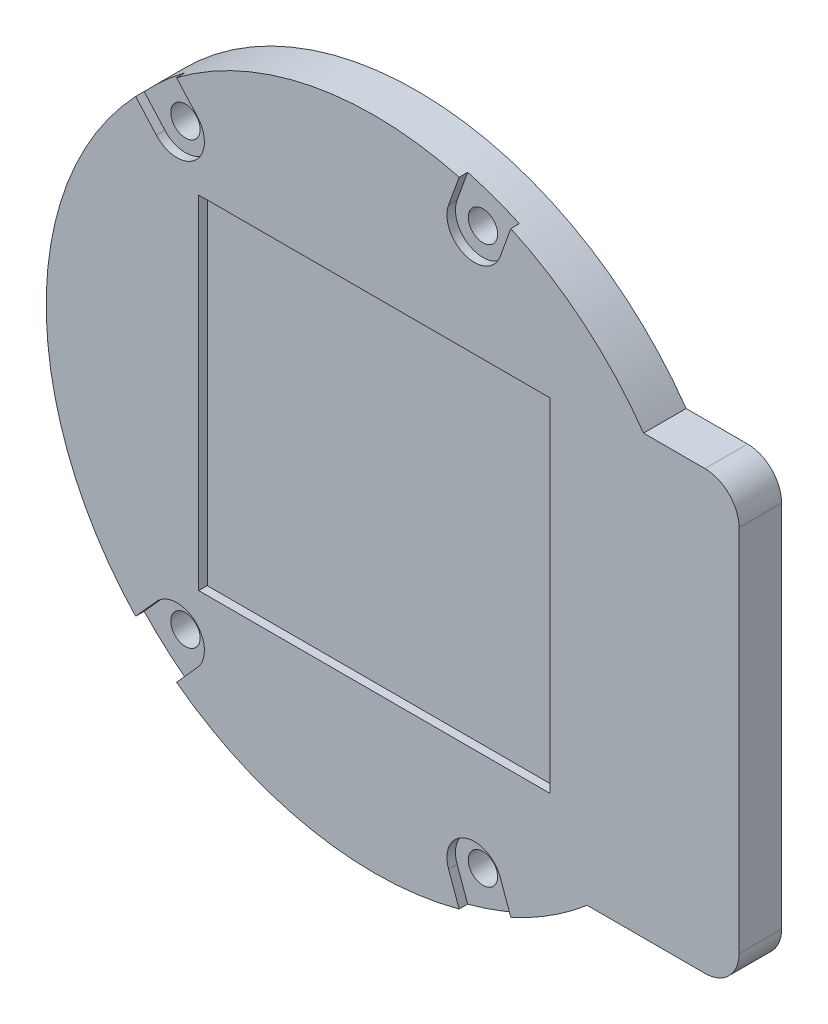
ISO-10303-21;
HEADER;
FILE_DESCRIPTION(('STEP AP214'),'2;1');
FILE_NAME('part.step','',(''),(''),'','','');
FILE_SCHEMA(('AUTOMOTIVE_DESIGN { 1 0 10303 214 1 1 1 1 }'));
ENDSEC;
DATA;
#1=APPLICATION_CONTEXT('core data for automotive mechanical design processes');
#2=APPLICATION_PROTOCOL_DEFINITION('international standard','automotive_design',2000,#1);
#3=PRODUCT_CONTEXT('',#1,'mechanical');
#4=PRODUCT('Part','Part','',(#3));
#5=PRODUCT_RELATED_PRODUCT_CATEGORY('part','',(#4));
#6=PRODUCT_DEFINITION_FORMATION('','',#4);
#7=PRODUCT_DEFINITION_CONTEXT('part definition',#1,'design');
#8=PRODUCT_DEFINITION('design','',#6,#7);
#9=PRODUCT_DEFINITION_SHAPE('','',#8);
#10=(LENGTH_UNIT() NAMED_UNIT(*) SI_UNIT(.MILLI.,.METRE.));
#11=(NAMED_UNIT(*) PLANE_ANGLE_UNIT() SI_UNIT($,.RADIAN.));
#12=(NAMED_UNIT(*) SI_UNIT($,.STERADIAN.) SOLID_ANGLE_UNIT());
#13=UNCERTAINTY_MEASURE_WITH_UNIT(LENGTH_MEASURE(1.E-05),#10,'distance_accuracy_value','');
#14=(GEOMETRIC_REPRESENTATION_CONTEXT(3) GLOBAL_UNCERTAINTY_ASSIGNED_CONTEXT((#13)) GLOBAL_UNIT_ASSIGNED_CONTEXT((#10,
#11,#12)) REPRESENTATION_CONTEXT('',''));
#15=CARTESIAN_POINT('',(0.,0.,0.));
#16=DIRECTION('',(0.,0.,1.));
#17=DIRECTION('',(1.,0.,0.));
#18=AXIS2_PLACEMENT_3D('',#15,#16,#17);
#19=CARTESIAN_POINT('',(0.,0.,4.));
#20=DIRECTION('',(0.,0.,1.));
#21=DIRECTION('',(1.,0.,0.));
#22=AXIS2_PLACEMENT_3D('',#19,#20,#21);
#23=PLANE('',#22);
#24=DIRECTION('',(0.338622846225682,-0.940922190201729,0.));
#25=VECTOR('',#24,1.);
#26=CARTESIAN_POINT('',(14.7846868274317,-31.5579413209222,4.));
#27=LINE('',#26,#25);
#28=CARTESIAN_POINT('',(14.7846868274317,-31.5579413209222,4.));
#29=VERTEX_POINT('',#28);
#30=CARTESIAN_POINT('',(16.0256343042209,-35.0061286798094,4.));
#31=VERTEX_POINT('',#30);
#32=EDGE_CURVE('E254',#29,#31,#27,.T.);
#33=ORIENTED_EDGE('',*,*,#32,.F.);
#34=CARTESIAN_POINT('',(11.7502127640311,-32.65,4.));
#35=DIRECTION('',(0.,0.,-1.));
#36=DIRECTION('',(-1.,0.,0.));
#37=AXIS2_PLACEMENT_3D('',#34,#35,#36);
#38=CIRCLE('',#37,3.225);
#39=CARTESIAN_POINT('',(8.71573870063056,-33.7420586790778,4.));
#40=VERTEX_POINT('',#39);
#41=EDGE_CURVE('E391',#40,#29,#38,.T.);
#42=ORIENTED_EDGE('',*,*,#41,.F.);
#43=DIRECTION('',(-0.338622846225681,0.940922190201729,0.));
#44=VECTOR('',#43,1.);
#45=CARTESIAN_POINT('',(8.71573870063056,-33.7420586790778,4.));
#46=LINE('',#45,#44);
#47=CARTESIAN_POINT('',(9.95668617741978,-37.1902460379651,4.));
#48=VERTEX_POINT('',#47);
#49=EDGE_CURVE('E800',#48,#40,#46,.T.);
#50=ORIENTED_EDGE('',*,*,#49,.F.);
#51=CARTESIAN_POINT('',(0.,0.,4.));
#52=DIRECTION('',(0.,0.,1.));
#53=DIRECTION('',(1.,0.,0.));
#54=AXIS2_PLACEMENT_3D('',#51,#52,#53);
#55=CIRCLE('',#54,38.5);
#56=EDGE_CURVE('E353',#48,#31,#55,.T.);
#57=ORIENTED_EDGE('',*,*,#56,.T.);
#58=EDGE_LOOP('',(#33,#42,#50,#57));
#59=FACE_BOUND('',#58,.T.);
#60=CARTESIAN_POINT('',(11.7502127640311,-32.65,4.));
#61=DIRECTION('',(0.,0.,1.));
#62=DIRECTION('',(1.,0.,0.));
#63=AXIS2_PLACEMENT_3D('',#60,#61,#62);
#64=CIRCLE('',#63,1.725);
#65=CARTESIAN_POINT('',(13.4752127640311,-32.65,4.));
#66=VERTEX_POINT('',#65);
#67=EDGE_CURVE('E435',#66,#66,#64,.T.);
#68=ORIENTED_EDGE('',*,*,#67,.F.);
#69=EDGE_LOOP('',(#68));
#70=FACE_BOUND('',#69,.T.);
#71=ADVANCED_FACE('F32',(#59,#70),#23,.T.);
#72=DIRECTION('',(-0.667434411909216,-0.744668587896253,0.));
#73=VECTOR('',#72,1.);
#74=CARTESIAN_POINT('',(-20.7584178972843,-27.9924759784072,4.));
#75=LINE('',#74,#73);
#76=CARTESIAN_POINT('',(-20.7584178972843,-27.9924759784072,4.));
#77=VERTEX_POINT('',#76);
#78=CARTESIAN_POINT('',(-23.2043575573303,-30.7214548866353,4.));
#79=VERTEX_POINT('',#78);
#80=EDGE_CURVE('E801',#77,#79,#75,.T.);
#81=ORIENTED_EDGE('',*,*,#80,.F.);
#82=CARTESIAN_POINT('',(-23.1599740932498,-25.84,4.));
#83=DIRECTION('',(0.,0.,-1.));
#84=DIRECTION('',(-1.,0.,0.));
#85=AXIS2_PLACEMENT_3D('',#82,#83,#84);
#86=CIRCLE('',#85,3.225);
#87=CARTESIAN_POINT('',(-25.5615302892152,-23.6875240215928,4.));
#88=VERTEX_POINT('',#87);
#89=EDGE_CURVE('E804',#88,#77,#86,.T.);
#90=ORIENTED_EDGE('',*,*,#89,.F.);
#91=DIRECTION('',(0.667434411909216,0.744668587896253,0.));
#92=VECTOR('',#91,1.);
#93=CARTESIAN_POINT('',(-25.5615302892152,-23.6875240215928,4.));
#94=LINE('',#93,#92);
#95=CARTESIAN_POINT('',(-28.0074699492611,-26.4165029298209,4.));
#96=VERTEX_POINT('',#95);
#97=EDGE_CURVE('E817',#96,#88,#94,.T.);
#98=ORIENTED_EDGE('',*,*,#97,.F.);
#99=EDGE_CURVE('E375',#96,#79,#55,.T.);
#100=ORIENTED_EDGE('',*,*,#99,.T.);
#101=EDGE_LOOP('',(#81,#90,#98,#100));
#102=FACE_BOUND('',#101,.T.);
#103=CARTESIAN_POINT('',(-23.1599740932498,-25.84,4.));
#104=DIRECTION('',(0.,0.,1.));
#105=DIRECTION('',(1.,0.,0.));
#106=AXIS2_PLACEMENT_3D('',#103,#104,#105);
#107=CIRCLE('',#106,1.725);
#108=CARTESIAN_POINT('',(-21.4349740932498,-25.84,4.));
#109=VERTEX_POINT('',#108);
#110=EDGE_CURVE('E439',#109,#109,#107,.T.);
#111=ORIENTED_EDGE('',*,*,#110,.F.);
#112=EDGE_LOOP('',(#111));
#113=FACE_BOUND('',#112,.T.);
#114=ADVANCED_FACE('F462',(#102,#113),#23,.T.);
#115=DIRECTION('',(-0.667434411909216,0.744668587896253,0.));
#116=VECTOR('',#115,1.);
#117=CARTESIAN_POINT('',(-25.5615302892152,23.6875240215928,4.));
#118=LINE('',#117,#116);
#119=CARTESIAN_POINT('',(-25.5615302892152,23.6875240215928,4.));
#120=VERTEX_POINT('',#119);
#121=CARTESIAN_POINT('',(-28.0074699492611,26.4165029298209,4.));
#122=VERTEX_POINT('',#121);
#123=EDGE_CURVE('E820',#120,#122,#118,.T.);
#124=ORIENTED_EDGE('',*,*,#123,.F.);
#125=CARTESIAN_POINT('',(-23.1599740932498,25.84,4.));
#126=DIRECTION('',(0.,0.,-1.));
#127=DIRECTION('',(1.,0.,0.));
#128=AXIS2_PLACEMENT_3D('',#125,#126,#127);
#129=CIRCLE('',#128,3.225);
#130=CARTESIAN_POINT('',(-20.7584178972843,27.9924759784072,4.));
#131=VERTEX_POINT('',#130);
#132=EDGE_CURVE('E300',#131,#120,#129,.T.);
#133=ORIENTED_EDGE('',*,*,#132,.F.);
#134=DIRECTION('',(0.667434411909216,-0.744668587896253,0.));
#135=VECTOR('',#134,1.);
#136=CARTESIAN_POINT('',(-20.7584178972843,27.9924759784072,4.));
#137=LINE('',#136,#135);
#138=CARTESIAN_POINT('',(-23.2043575573303,30.7214548866353,4.));
#139=VERTEX_POINT('',#138);
#140=EDGE_CURVE('E306',#139,#131,#137,.T.);
#141=ORIENTED_EDGE('',*,*,#140,.F.);
#142=EDGE_CURVE('E365',#139,#122,#55,.T.);
#143=ORIENTED_EDGE('',*,*,#142,.T.);
#144=EDGE_LOOP('',(#124,#133,#141,#143));
#145=FACE_BOUND('',#144,.T.);
#146=CARTESIAN_POINT('',(-23.1599740932498,25.84,4.));
#147=DIRECTION('',(0.,0.,1.));
#148=DIRECTION('',(1.,0.,0.));
#149=AXIS2_PLACEMENT_3D('',#146,#147,#148);
#150=CIRCLE('',#149,1.725);
#151=CARTESIAN_POINT('',(-21.4349740932498,25.84,4.));
#152=VERTEX_POINT('',#151);
#153=EDGE_CURVE('E429',#152,#152,#150,.T.);
#154=ORIENTED_EDGE('',*,*,#153,.F.);
#155=EDGE_LOOP('',(#154));
#156=FACE_BOUND('',#155,.T.);
#157=ADVANCED_FACE('F468',(#145,#156),#23,.T.);
#158=DIRECTION('',(0.338622846225681,0.940922190201729,0.));
#159=VECTOR('',#158,1.);
#160=CARTESIAN_POINT('',(8.71573870063056,33.7420586790778,4.));
#161=LINE('',#160,#159);
#162=CARTESIAN_POINT('',(8.71573870063056,33.7420586790778,4.));
#163=VERTEX_POINT('',#162);
#164=CARTESIAN_POINT('',(9.95668617741978,37.1902460379651,4.));
#165=VERTEX_POINT('',#164);
#166=EDGE_CURVE('E297',#163,#165,#161,.T.);
#167=ORIENTED_EDGE('',*,*,#166,.F.);
#168=CARTESIAN_POINT('',(11.7502127640311,32.65,4.));
#169=DIRECTION('',(0.,0.,-1.));
#170=DIRECTION('',(1.,0.,0.));
#171=AXIS2_PLACEMENT_3D('',#168,#169,#170);
#172=CIRCLE('',#171,3.225);
#173=CARTESIAN_POINT('',(14.7846868274317,31.5579413209222,4.));
#174=VERTEX_POINT('',#173);
#175=EDGE_CURVE('E294',#174,#163,#172,.T.);
#176=ORIENTED_EDGE('',*,*,#175,.F.);
#177=DIRECTION('',(-0.338622846225682,-0.940922190201729,0.));
#178=VECTOR('',#177,1.);
#179=CARTESIAN_POINT('',(14.7846868274317,31.5579413209222,4.));
#180=LINE('',#179,#178);
#181=CARTESIAN_POINT('',(16.0256343042209,35.0061286798094,4.));
#182=VERTEX_POINT('',#181);
#183=EDGE_CURVE('E226',#182,#174,#180,.T.);
#184=ORIENTED_EDGE('',*,*,#183,.F.);
#185=EDGE_CURVE('E360',#182,#165,#55,.T.);
#186=ORIENTED_EDGE('',*,*,#185,.T.);
#187=EDGE_LOOP('',(#167,#176,#184,#186));
#188=FACE_BOUND('',#187,.T.);
#189=CARTESIAN_POINT('',(11.7502127640311,32.65,4.));
#190=DIRECTION('',(0.,0.,1.));
#191=DIRECTION('',(1.,0.,0.));
#192=AXIS2_PLACEMENT_3D('',#189,#190,#191);
#193=CIRCLE('',#192,1.725);
#194=CARTESIAN_POINT('',(13.4752127640311,32.65,4.));
#195=VERTEX_POINT('',#194);
#196=EDGE_CURVE('E423',#195,#195,#193,.T.);
#197=ORIENTED_EDGE('',*,*,#196,.F.);
#198=EDGE_LOOP('',(#197));
#199=FACE_BOUND('',#198,.T.);
#200=ADVANCED_FACE('F464',(#188,#199),#23,.T.);
#201=CARTESIAN_POINT('',(0.,0.,0.));
#202=DIRECTION('',(0.,0.,1.));
#203=DIRECTION('',(1.,0.,0.));
#204=AXIS2_PLACEMENT_3D('',#201,#202,#203);
#205=PLANE('',#204);
#206=CARTESIAN_POINT('',(-23.1599740932498,25.84,0.));
#207=DIRECTION('',(0.,0.,1.));
#208=DIRECTION('',(1.,0.,0.));
#209=AXIS2_PLACEMENT_3D('',#206,#207,#208);
#210=CIRCLE('',#209,1.725);
#211=CARTESIAN_POINT('',(-21.4349740932498,25.84,0.));
#212=VERTEX_POINT('',#211);
#213=EDGE_CURVE('E426',#212,#212,#210,.T.);
#214=ORIENTED_EDGE('',*,*,#213,.T.);
#215=EDGE_LOOP('',(#214));
#216=FACE_BOUND('',#215,.T.);
#217=CARTESIAN_POINT('',(-23.1599740932498,-25.84,0.));
#218=DIRECTION('',(0.,0.,1.));
#219=DIRECTION('',(1.,0.,0.));
#220=AXIS2_PLACEMENT_3D('',#217,#218,#219);
#221=CIRCLE('',#220,1.725);
#222=CARTESIAN_POINT('',(-21.4349740932498,-25.84,0.));
#223=VERTEX_POINT('',#222);
#224=EDGE_CURVE('E369',#223,#223,#221,.T.);
#225=ORIENTED_EDGE('',*,*,#224,.T.);
#226=EDGE_LOOP('',(#225));
#227=FACE_BOUND('',#226,.T.);
#228=DIRECTION('',(-1.,0.,0.));
#229=VECTOR('',#228,1.);
#230=CARTESIAN_POINT('',(31.5950945559592,22.,0.));
#231=LINE('',#230,#229);
#232=CARTESIAN_POINT('',(38.8,22.,0.));
#233=VERTEX_POINT('',#232);
#234=CARTESIAN_POINT('',(31.5950945559592,22.,0.));
#235=VERTEX_POINT('',#234);
#236=EDGE_CURVE('E348',#233,#235,#231,.T.);
#237=ORIENTED_EDGE('',*,*,#236,.F.);
#238=CARTESIAN_POINT('',(38.8,18.,0.));
#239=DIRECTION('',(0.,0.,1.));
#240=DIRECTION('',(1.,0.,0.));
#241=AXIS2_PLACEMENT_3D('',#238,#239,#240);
#242=CIRCLE('',#241,4.);
#243=CARTESIAN_POINT('',(42.8,18.,0.));
#244=VERTEX_POINT('',#243);
#245=EDGE_CURVE('E322',#233,#244,#242,.F.);
#246=ORIENTED_EDGE('',*,*,#245,.T.);
#247=DIRECTION('',(0.,1.,0.));
#248=VECTOR('',#247,1.);
#249=CARTESIAN_POINT('',(42.8,22.,0.));
#250=LINE('',#249,#248);
#251=CARTESIAN_POINT('',(42.8,-25.3,0.));
#252=VERTEX_POINT('',#251);
#253=EDGE_CURVE('E346',#252,#244,#250,.T.);
#254=ORIENTED_EDGE('',*,*,#253,.F.);
#255=CARTESIAN_POINT('',(38.8,-25.3,0.));
#256=DIRECTION('',(0.,0.,1.));
#257=DIRECTION('',(1.,0.,0.));
#258=AXIS2_PLACEMENT_3D('',#255,#256,#257);
#259=CIRCLE('',#258,4.);
#260=CARTESIAN_POINT('',(38.8,-29.3,0.));
#261=VERTEX_POINT('',#260);
#262=EDGE_CURVE('E319',#252,#261,#259,.F.);
#263=ORIENTED_EDGE('',*,*,#262,.T.);
#264=DIRECTION('',(1.,0.,0.));
#265=VECTOR('',#264,1.);
#266=CARTESIAN_POINT('',(42.8,-29.3,0.));
#267=LINE('',#266,#265);
#268=CARTESIAN_POINT('',(24.9751876869824,-29.3,0.));
#269=VERTEX_POINT('',#268);
#270=EDGE_CURVE('E351',#269,#261,#267,.T.);
#271=ORIENTED_EDGE('',*,*,#270,.F.);
#272=CARTESIAN_POINT('',(0.,0.,0.));
#273=DIRECTION('',(0.,0.,1.));
#274=DIRECTION('',(1.,0.,0.));
#275=AXIS2_PLACEMENT_3D('',#272,#273,#274);
#276=CIRCLE('',#275,38.5);
#277=EDGE_CURVE('E355',#235,#269,#276,.T.);
#278=ORIENTED_EDGE('',*,*,#277,.F.);
#279=EDGE_LOOP('',(#237,#246,#254,#263,#271,#278));
#280=FACE_BOUND('',#279,.T.);
#281=CARTESIAN_POINT('',(11.7502127640311,-32.65,0.));
#282=DIRECTION('',(0.,0.,1.));
#283=DIRECTION('',(1.,0.,0.));
#284=AXIS2_PLACEMENT_3D('',#281,#282,#283);
#285=CIRCLE('',#284,1.725);
#286=CARTESIAN_POINT('',(13.4752127640311,-32.65,0.));
#287=VERTEX_POINT('',#286);
#288=EDGE_CURVE('E432',#287,#287,#285,.T.);
#289=ORIENTED_EDGE('',*,*,#288,.T.);
#290=EDGE_LOOP('',(#289));
#291=FACE_BOUND('',#290,.T.);
#292=CARTESIAN_POINT('',(11.7502127640311,32.65,0.));
#293=DIRECTION('',(0.,0.,1.));
#294=DIRECTION('',(1.,0.,0.));
#295=AXIS2_PLACEMENT_3D('',#292,#293,#294);
#296=CIRCLE('',#295,1.725);
#297=CARTESIAN_POINT('',(13.4752127640311,32.65,0.));
#298=VERTEX_POINT('',#297);
#299=EDGE_CURVE('E384',#298,#298,#296,.T.);
#300=ORIENTED_EDGE('',*,*,#299,.T.);
#301=EDGE_LOOP('',(#300));
#302=FACE_BOUND('',#301,.T.);
#303=ADVANCED_FACE('F344',(#216,#227,#280,#291,#302),#205,.F.);
#304=CARTESIAN_POINT('',(0.,0.,4.));
#305=DIRECTION('',(0.,0.,-1.));
#306=DIRECTION('',(-1.,0.,0.));
#307=AXIS2_PLACEMENT_3D('',#304,#305,#306);
#308=CYLINDRICAL_SURFACE('',#307,38.5);
#309=ORIENTED_EDGE('',*,*,#277,.T.);
#310=DIRECTION('',(0.,0.,-1.));
#311=VECTOR('',#310,1.);
#312=CARTESIAN_POINT('',(24.9751876869824,-29.3,4.));
#313=LINE('',#312,#311);
#314=CARTESIAN_POINT('',(24.9751876869824,-29.3,5.));
#315=VERTEX_POINT('',#314);
#316=EDGE_CURVE('E320',#315,#269,#313,.T.);
#317=ORIENTED_EDGE('',*,*,#316,.F.);
#318=CARTESIAN_POINT('',(0.,0.,5.));
#319=DIRECTION('',(0.,0.,1.));
#320=DIRECTION('',(1.,0.,0.));
#321=AXIS2_PLACEMENT_3D('',#318,#319,#320);
#322=CIRCLE('',#321,38.5);
#323=CARTESIAN_POINT('',(16.0256343042209,-35.0061286798094,5.));
#324=VERTEX_POINT('',#323);
#325=EDGE_CURVE('E284',#324,#315,#322,.T.);
#326=ORIENTED_EDGE('',*,*,#325,.F.);
#327=DIRECTION('',(0.,0.,-1.));
#328=VECTOR('',#327,1.);
#329=CARTESIAN_POINT('',(16.0256343042209,-35.0061286798094,5.));
#330=LINE('',#329,#328);
#331=EDGE_CURVE('E293',#324,#31,#330,.T.);
#332=ORIENTED_EDGE('',*,*,#331,.T.);
#333=ORIENTED_EDGE('',*,*,#56,.F.);
#334=DIRECTION('',(0.,0.,-1.));
#335=VECTOR('',#334,1.);
#336=CARTESIAN_POINT('',(9.95668617741978,-37.1902460379651,5.));
#337=LINE('',#336,#335);
#338=CARTESIAN_POINT('',(9.95668617741978,-37.1902460379651,5.));
#339=VERTEX_POINT('',#338);
#340=EDGE_CURVE('E403',#339,#48,#337,.T.);
#341=ORIENTED_EDGE('',*,*,#340,.F.);
#342=CARTESIAN_POINT('',(0.,0.,5.));
#343=DIRECTION('',(0.,0.,1.));
#344=DIRECTION('',(1.,0.,0.));
#345=AXIS2_PLACEMENT_3D('',#342,#343,#344);
#346=CIRCLE('',#345,38.5);
#347=CARTESIAN_POINT('',(-23.2043575573303,-30.7214548866353,5.));
#348=VERTEX_POINT('',#347);
#349=EDGE_CURVE('E276',#348,#339,#346,.T.);
#350=ORIENTED_EDGE('',*,*,#349,.F.);
#351=DIRECTION('',(0.,0.,-1.));
#352=VECTOR('',#351,1.);
#353=CARTESIAN_POINT('',(-23.2043575573303,-30.7214548866353,5.));
#354=LINE('',#353,#352);
#355=EDGE_CURVE('E408',#348,#79,#354,.T.);
#356=ORIENTED_EDGE('',*,*,#355,.T.);
#357=ORIENTED_EDGE('',*,*,#99,.F.);
#358=DIRECTION('',(0.,0.,-1.));
#359=VECTOR('',#358,1.);
#360=CARTESIAN_POINT('',(-28.0074699492611,-26.4165029298209,5.));
#361=LINE('',#360,#359);
#362=CARTESIAN_POINT('',(-28.0074699492611,-26.4165029298209,5.));
#363=VERTEX_POINT('',#362);
#364=EDGE_CURVE('E411',#363,#96,#361,.T.);
#365=ORIENTED_EDGE('',*,*,#364,.F.);
#366=CARTESIAN_POINT('',(0.,0.,5.));
#367=DIRECTION('',(0.,0.,1.));
#368=DIRECTION('',(1.,0.,0.));
#369=AXIS2_PLACEMENT_3D('',#366,#367,#368);
#370=CIRCLE('',#369,38.5);
#371=CARTESIAN_POINT('',(-28.0074699492611,26.4165029298209,5.));
#372=VERTEX_POINT('',#371);
#373=EDGE_CURVE('E268',#372,#363,#370,.T.);
#374=ORIENTED_EDGE('',*,*,#373,.F.);
#375=DIRECTION('',(0.,0.,-1.));
#376=VECTOR('',#375,1.);
#377=CARTESIAN_POINT('',(-28.0074699492611,26.4165029298209,5.));
#378=LINE('',#377,#376);
#379=EDGE_CURVE('E416',#372,#122,#378,.T.);
#380=ORIENTED_EDGE('',*,*,#379,.T.);
#381=ORIENTED_EDGE('',*,*,#142,.F.);
#382=DIRECTION('',(0.,0.,-1.));
#383=VECTOR('',#382,1.);
#384=CARTESIAN_POINT('',(-23.2043575573303,30.7214548866353,5.));
#385=LINE('',#384,#383);
#386=CARTESIAN_POINT('',(-23.2043575573303,30.7214548866353,5.));
#387=VERTEX_POINT('',#386);
#388=EDGE_CURVE('E313',#387,#139,#385,.T.);
#389=ORIENTED_EDGE('',*,*,#388,.F.);
#390=CARTESIAN_POINT('',(0.,0.,5.));
#391=DIRECTION('',(0.,0.,1.));
#392=DIRECTION('',(1.,0.,0.));
#393=AXIS2_PLACEMENT_3D('',#390,#391,#392);
#394=CIRCLE('',#393,38.5);
#395=CARTESIAN_POINT('',(9.95668617741978,37.1902460379651,5.));
#396=VERTEX_POINT('',#395);
#397=EDGE_CURVE('E260',#396,#387,#394,.T.);
#398=ORIENTED_EDGE('',*,*,#397,.F.);
#399=DIRECTION('',(0.,0.,-1.));
#400=VECTOR('',#399,1.);
#401=CARTESIAN_POINT('',(9.95668617741978,37.1902460379651,5.));
#402=LINE('',#401,#400);
#403=EDGE_CURVE('E309',#396,#165,#402,.T.);
#404=ORIENTED_EDGE('',*,*,#403,.T.);
#405=ORIENTED_EDGE('',*,*,#185,.F.);
#406=DIRECTION('',(0.,0.,-1.));
#407=VECTOR('',#406,1.);
#408=CARTESIAN_POINT('',(16.0256343042209,35.0061286798094,5.));
#409=LINE('',#408,#407);
#410=CARTESIAN_POINT('',(16.0256343042209,35.0061286798094,5.));
#411=VERTEX_POINT('',#410);
#412=EDGE_CURVE('E381',#411,#182,#409,.T.);
#413=ORIENTED_EDGE('',*,*,#412,.F.);
#414=CARTESIAN_POINT('',(0.,0.,5.));
#415=DIRECTION('',(0.,0.,1.));
#416=DIRECTION('',(1.,0.,0.));
#417=AXIS2_PLACEMENT_3D('',#414,#415,#416);
#418=CIRCLE('',#417,38.5);
#419=CARTESIAN_POINT('',(31.5950945559592,22.,5.));
#420=VERTEX_POINT('',#419);
#421=EDGE_CURVE('E250',#420,#411,#418,.T.);
#422=ORIENTED_EDGE('',*,*,#421,.F.);
#423=DIRECTION('',(0.,0.,-1.));
#424=VECTOR('',#423,1.);
#425=CARTESIAN_POINT('',(31.5950945559592,22.,4.));
#426=LINE('',#425,#424);
#427=EDGE_CURVE('E339',#420,#235,#426,.T.);
#428=ORIENTED_EDGE('',*,*,#427,.T.);
#429=EDGE_LOOP('',(#309,#317,#326,#332,#333,#341,#350,#356,#357,#365,#374,#380,#381,#389,#398,
#404,#405,#413,#422,#428));
#430=FACE_BOUND('',#429,.T.);
#431=ADVANCED_FACE('F479',(#430),#308,.T.);
#432=CARTESIAN_POINT('',(42.8,-29.3,4.));
#433=DIRECTION('',(0.,1.,0.));
#434=DIRECTION('',(-1.,0.,0.));
#435=AXIS2_PLACEMENT_3D('',#432,#433,#434);
#436=PLANE('',#435);
#437=ORIENTED_EDGE('',*,*,#270,.T.);
#438=DIRECTION('',(0.,0.,-1.));
#439=VECTOR('',#438,1.);
#440=CARTESIAN_POINT('',(38.8,-29.3,4.));
#441=LINE('',#440,#439);
#442=CARTESIAN_POINT('',(38.8,-29.3,5.));
#443=VERTEX_POINT('',#442);
#444=EDGE_CURVE('E11',#261,#443,#441,.F.);
#445=ORIENTED_EDGE('',*,*,#444,.T.);
#446=DIRECTION('',(1.,0.,0.));
#447=VECTOR('',#446,1.);
#448=CARTESIAN_POINT('',(42.8,-29.3,5.));
#449=LINE('',#448,#447);
#450=EDGE_CURVE('E287',#315,#443,#449,.T.);
#451=ORIENTED_EDGE('',*,*,#450,.F.);
#452=ORIENTED_EDGE('',*,*,#316,.T.);
#453=EDGE_LOOP('',(#437,#445,#451,#452));
#454=FACE_BOUND('',#453,.T.);
#455=ADVANCED_FACE('F666',(#454),#436,.F.);
#456=CARTESIAN_POINT('',(42.8,22.,4.));
#457=DIRECTION('',(-1.,0.,0.));
#458=DIRECTION('',(0.,-1.,0.));
#459=AXIS2_PLACEMENT_3D('',#456,#457,#458);
#460=PLANE('',#459);
#461=ORIENTED_EDGE('',*,*,#253,.T.);
#462=DIRECTION('',(0.,0.,-1.));
#463=VECTOR('',#462,1.);
#464=CARTESIAN_POINT('',(42.8,18.,4.));
#465=LINE('',#464,#463);
#466=CARTESIAN_POINT('',(42.8,18.,5.));
#467=VERTEX_POINT('',#466);
#468=EDGE_CURVE('E53',#244,#467,#465,.F.);
#469=ORIENTED_EDGE('',*,*,#468,.T.);
#470=DIRECTION('',(0.,1.,0.));
#471=VECTOR('',#470,1.);
#472=CARTESIAN_POINT('',(42.8,22.,5.));
#473=LINE('',#472,#471);
#474=CARTESIAN_POINT('',(42.8,-25.3,5.));
#475=VERTEX_POINT('',#474);
#476=EDGE_CURVE('E289',#475,#467,#473,.T.);
#477=ORIENTED_EDGE('',*,*,#476,.F.);
#478=DIRECTION('',(0.,0.,-1.));
#479=VECTOR('',#478,1.);
#480=CARTESIAN_POINT('',(42.8,-25.3,4.));
#481=LINE('',#480,#479);
#482=EDGE_CURVE('E324',#475,#252,#481,.T.);
#483=ORIENTED_EDGE('',*,*,#482,.T.);
#484=EDGE_LOOP('',(#461,#469,#477,#483));
#485=FACE_BOUND('',#484,.T.);
#486=ADVANCED_FACE('F349',(#485),#460,.F.);
#487=CARTESIAN_POINT('',(31.5950945559592,22.,4.));
#488=DIRECTION('',(0.,-1.,0.));
#489=DIRECTION('',(0.,0.,-1.));
#490=AXIS2_PLACEMENT_3D('',#487,#488,#489);
#491=PLANE('',#490);
#492=DIRECTION('',(-1.,0.,0.));
#493=VECTOR('',#492,1.);
#494=CARTESIAN_POINT('',(31.5950945559592,22.,5.));
#495=LINE('',#494,#493);
#496=CARTESIAN_POINT('',(38.8,22.,5.));
#497=VERTEX_POINT('',#496);
#498=EDGE_CURVE('E291',#497,#420,#495,.T.);
#499=ORIENTED_EDGE('',*,*,#498,.F.);
#500=DIRECTION('',(0.,0.,-1.));
#501=VECTOR('',#500,1.);
#502=CARTESIAN_POINT('',(38.8,22.,4.));
#503=LINE('',#502,#501);
#504=EDGE_CURVE('E316',#497,#233,#503,.T.);
#505=ORIENTED_EDGE('',*,*,#504,.T.);
#506=ORIENTED_EDGE('',*,*,#236,.T.);
#507=ORIENTED_EDGE('',*,*,#427,.F.);
#508=EDGE_LOOP('',(#499,#505,#506,#507));
#509=FACE_BOUND('',#508,.T.);
#510=ADVANCED_FACE('F336',(#509),#491,.F.);
#511=CARTESIAN_POINT('',(-23.1599740932498,-25.84,4.));
#512=DIRECTION('',(0.,0.,-1.));
#513=DIRECTION('',(-1.,0.,0.));
#514=AXIS2_PLACEMENT_3D('',#511,#512,#513);
#515=CYLINDRICAL_SURFACE('',#514,1.725);
#516=ORIENTED_EDGE('',*,*,#110,.T.);
#517=EDGE_LOOP('',(#516));
#518=FACE_BOUND('',#517,.T.);
#519=ORIENTED_EDGE('',*,*,#224,.F.);
#520=EDGE_LOOP('',(#519));
#521=FACE_BOUND('',#520,.T.);
#522=ADVANCED_FACE('F448',(#518,#521),#515,.F.);
#523=CARTESIAN_POINT('',(11.7502127640311,-32.65,4.));
#524=DIRECTION('',(0.,0.,-1.));
#525=DIRECTION('',(-1.,0.,0.));
#526=AXIS2_PLACEMENT_3D('',#523,#524,#525);
#527=CYLINDRICAL_SURFACE('',#526,1.725);
#528=ORIENTED_EDGE('',*,*,#67,.T.);
#529=EDGE_LOOP('',(#528));
#530=FACE_BOUND('',#529,.T.);
#531=ORIENTED_EDGE('',*,*,#288,.F.);
#532=EDGE_LOOP('',(#531));
#533=FACE_BOUND('',#532,.T.);
#534=ADVANCED_FACE('F450',(#530,#533),#527,.F.);
#535=CARTESIAN_POINT('',(-23.1599740932498,25.84,4.));
#536=DIRECTION('',(0.,0.,-1.));
#537=DIRECTION('',(-1.,0.,0.));
#538=AXIS2_PLACEMENT_3D('',#535,#536,#537);
#539=CYLINDRICAL_SURFACE('',#538,1.725);
#540=ORIENTED_EDGE('',*,*,#153,.T.);
#541=EDGE_LOOP('',(#540));
#542=FACE_BOUND('',#541,.T.);
#543=ORIENTED_EDGE('',*,*,#213,.F.);
#544=EDGE_LOOP('',(#543));
#545=FACE_BOUND('',#544,.T.);
#546=ADVANCED_FACE('F456',(#542,#545),#539,.F.);
#547=CARTESIAN_POINT('',(11.7502127640311,32.65,4.));
#548=DIRECTION('',(0.,0.,-1.));
#549=DIRECTION('',(-1.,0.,0.));
#550=AXIS2_PLACEMENT_3D('',#547,#548,#549);
#551=CYLINDRICAL_SURFACE('',#550,1.725);
#552=ORIENTED_EDGE('',*,*,#196,.T.);
#553=EDGE_LOOP('',(#552));
#554=FACE_BOUND('',#553,.T.);
#555=ORIENTED_EDGE('',*,*,#299,.F.);
#556=EDGE_LOOP('',(#555));
#557=FACE_BOUND('',#556,.T.);
#558=ADVANCED_FACE('F509',(#554,#557),#551,.F.);
#559=CARTESIAN_POINT('',(0.,0.,5.));
#560=DIRECTION('',(0.,0.,1.));
#561=DIRECTION('',(1.,0.,0.));
#562=AXIS2_PLACEMENT_3D('',#559,#560,#561);
#563=PLANE('',#562);
#564=ORIENTED_EDGE('',*,*,#476,.T.);
#565=CARTESIAN_POINT('',(38.8,18.,5.));
#566=DIRECTION('',(0.,0.,1.));
#567=DIRECTION('',(1.,0.,0.));
#568=AXIS2_PLACEMENT_3D('',#565,#566,#567);
#569=CIRCLE('',#568,4.);
#570=EDGE_CURVE('E40',#467,#497,#569,.T.);
#571=ORIENTED_EDGE('',*,*,#570,.T.);
#572=ORIENTED_EDGE('',*,*,#498,.T.);
#573=ORIENTED_EDGE('',*,*,#421,.T.);
#574=DIRECTION('',(-0.338622846225682,-0.940922190201729,0.));
#575=VECTOR('',#574,1.);
#576=CARTESIAN_POINT('',(14.7846868274317,31.5579413209222,5.));
#577=LINE('',#576,#575);
#578=CARTESIAN_POINT('',(14.7846868274317,31.5579413209222,5.));
#579=VERTEX_POINT('',#578);
#580=EDGE_CURVE('E253',#411,#579,#577,.T.);
#581=ORIENTED_EDGE('',*,*,#580,.T.);
#582=CARTESIAN_POINT('',(11.7502127640311,32.65,5.));
#583=DIRECTION('',(0.,0.,-1.));
#584=DIRECTION('',(1.,0.,0.));
#585=AXIS2_PLACEMENT_3D('',#582,#583,#584);
#586=CIRCLE('',#585,3.225);
#587=CARTESIAN_POINT('',(8.71573870063056,33.7420586790778,5.));
#588=VERTEX_POINT('',#587);
#589=EDGE_CURVE('E256',#579,#588,#586,.T.);
#590=ORIENTED_EDGE('',*,*,#589,.T.);
#591=DIRECTION('',(0.338622846225681,0.940922190201729,0.));
#592=VECTOR('',#591,1.);
#593=CARTESIAN_POINT('',(8.71573870063056,33.7420586790778,5.));
#594=LINE('',#593,#592);
#595=EDGE_CURVE('E258',#588,#396,#594,.T.);
#596=ORIENTED_EDGE('',*,*,#595,.T.);
#597=ORIENTED_EDGE('',*,*,#397,.T.);
#598=DIRECTION('',(0.667434411909216,-0.744668587896253,0.));
#599=VECTOR('',#598,1.);
#600=CARTESIAN_POINT('',(-20.7584178972843,27.9924759784072,5.));
#601=LINE('',#600,#599);
#602=CARTESIAN_POINT('',(-20.7584178972843,27.9924759784072,5.));
#603=VERTEX_POINT('',#602);
#604=EDGE_CURVE('E262',#387,#603,#601,.T.);
#605=ORIENTED_EDGE('',*,*,#604,.T.);
#606=CARTESIAN_POINT('',(-23.1599740932498,25.84,5.));
#607=DIRECTION('',(0.,0.,-1.));
#608=DIRECTION('',(1.,0.,0.));
#609=AXIS2_PLACEMENT_3D('',#606,#607,#608);
#610=CIRCLE('',#609,3.225);
#611=CARTESIAN_POINT('',(-25.5615302892152,23.6875240215928,5.));
#612=VERTEX_POINT('',#611);
#613=EDGE_CURVE('E264',#603,#612,#610,.T.);
#614=ORIENTED_EDGE('',*,*,#613,.T.);
#615=DIRECTION('',(-0.667434411909216,0.744668587896253,0.));
#616=VECTOR('',#615,1.);
#617=CARTESIAN_POINT('',(-25.5615302892152,23.6875240215928,5.));
#618=LINE('',#617,#616);
#619=EDGE_CURVE('E266',#612,#372,#618,.T.);
#620=ORIENTED_EDGE('',*,*,#619,.T.);
#621=ORIENTED_EDGE('',*,*,#373,.T.);
#622=DIRECTION('',(0.667434411909216,0.744668587896253,0.));
#623=VECTOR('',#622,1.);
#624=CARTESIAN_POINT('',(-25.5615302892152,-23.6875240215928,5.));
#625=LINE('',#624,#623);
#626=CARTESIAN_POINT('',(-25.5615302892152,-23.6875240215928,5.));
#627=VERTEX_POINT('',#626);
#628=EDGE_CURVE('E270',#363,#627,#625,.T.);
#629=ORIENTED_EDGE('',*,*,#628,.T.);
#630=CARTESIAN_POINT('',(-23.1599740932498,-25.84,5.));
#631=DIRECTION('',(0.,0.,-1.));
#632=DIRECTION('',(-1.,0.,0.));
#633=AXIS2_PLACEMENT_3D('',#630,#631,#632);
#634=CIRCLE('',#633,3.225);
#635=CARTESIAN_POINT('',(-20.7584178972843,-27.9924759784072,5.));
#636=VERTEX_POINT('',#635);
#637=EDGE_CURVE('E272',#627,#636,#634,.T.);
#638=ORIENTED_EDGE('',*,*,#637,.T.);
#639=DIRECTION('',(-0.667434411909216,-0.744668587896253,0.));
#640=VECTOR('',#639,1.);
#641=CARTESIAN_POINT('',(-20.7584178972843,-27.9924759784072,5.));
#642=LINE('',#641,#640);
#643=EDGE_CURVE('E274',#636,#348,#642,.T.);
#644=ORIENTED_EDGE('',*,*,#643,.T.);
#645=ORIENTED_EDGE('',*,*,#349,.T.);
#646=DIRECTION('',(-0.338622846225681,0.940922190201729,0.));
#647=VECTOR('',#646,1.);
#648=CARTESIAN_POINT('',(8.71573870063056,-33.7420586790778,5.));
#649=LINE('',#648,#647);
#650=CARTESIAN_POINT('',(8.71573870063056,-33.7420586790778,5.));
#651=VERTEX_POINT('',#650);
#652=EDGE_CURVE('E278',#339,#651,#649,.T.);
#653=ORIENTED_EDGE('',*,*,#652,.T.);
#654=CARTESIAN_POINT('',(11.7502127640311,-32.65,5.));
#655=DIRECTION('',(0.,0.,-1.));
#656=DIRECTION('',(-1.,0.,0.));
#657=AXIS2_PLACEMENT_3D('',#654,#655,#656);
#658=CIRCLE('',#657,3.225);
#659=CARTESIAN_POINT('',(14.7846868274317,-31.5579413209222,5.));
#660=VERTEX_POINT('',#659);
#661=EDGE_CURVE('E280',#651,#660,#658,.T.);
#662=ORIENTED_EDGE('',*,*,#661,.T.);
#663=DIRECTION('',(0.338622846225682,-0.940922190201729,0.));
#664=VECTOR('',#663,1.);
#665=CARTESIAN_POINT('',(14.7846868274317,-31.5579413209222,5.));
#666=LINE('',#665,#664);
#667=EDGE_CURVE('E282',#660,#324,#666,.T.);
#668=ORIENTED_EDGE('',*,*,#667,.T.);
#669=ORIENTED_EDGE('',*,*,#325,.T.);
#670=ORIENTED_EDGE('',*,*,#450,.T.);
#671=CARTESIAN_POINT('',(38.8,-25.3,5.));
#672=DIRECTION('',(0.,0.,1.));
#673=DIRECTION('',(1.,0.,0.));
#674=AXIS2_PLACEMENT_3D('',#671,#672,#673);
#675=CIRCLE('',#674,4.);
#676=EDGE_CURVE('E328',#443,#475,#675,.T.);
#677=ORIENTED_EDGE('',*,*,#676,.T.);
#678=EDGE_LOOP('',(#564,#571,#572,#573,#581,#590,#596,#597,#605,#614,#620,#621,#629,#638,#644,
#645,#653,#662,#668,#669,#670,#677));
#679=FACE_BOUND('',#678,.T.);
#680=DIRECTION('',(-1.,0.,0.));
#681=VECTOR('',#680,1.);
#682=CARTESIAN_POINT('',(-20.6,20.1,5.));
#683=LINE('',#682,#681);
#684=CARTESIAN_POINT('',(20.6,20.1,5.));
#685=VERTEX_POINT('',#684);
#686=CARTESIAN_POINT('',(-20.6,20.1,5.));
#687=VERTEX_POINT('',#686);
#688=EDGE_CURVE('E218',#685,#687,#683,.T.);
#689=ORIENTED_EDGE('',*,*,#688,.F.);
#690=DIRECTION('',(0.,1.,0.));
#691=VECTOR('',#690,1.);
#692=CARTESIAN_POINT('',(20.6,20.1,5.));
#693=LINE('',#692,#691);
#694=CARTESIAN_POINT('',(20.6,-20.1,5.));
#695=VERTEX_POINT('',#694);
#696=EDGE_CURVE('E208',#695,#685,#693,.T.);
#697=ORIENTED_EDGE('',*,*,#696,.F.);
#698=DIRECTION('',(1.,0.,0.));
#699=VECTOR('',#698,1.);
#700=CARTESIAN_POINT('',(-20.6,-20.1,5.));
#701=LINE('',#700,#699);
#702=CARTESIAN_POINT('',(-20.6,-20.1,5.));
#703=VERTEX_POINT('',#702);
#704=EDGE_CURVE('E234',#703,#695,#701,.T.);
#705=ORIENTED_EDGE('',*,*,#704,.F.);
#706=DIRECTION('',(0.,-1.,0.));
#707=VECTOR('',#706,1.);
#708=CARTESIAN_POINT('',(-20.6,20.1,5.));
#709=LINE('',#708,#707);
#710=EDGE_CURVE('E232',#687,#703,#709,.T.);
#711=ORIENTED_EDGE('',*,*,#710,.F.);
#712=EDGE_LOOP('',(#689,#697,#705,#711));
#713=FACE_BOUND('',#712,.T.);
#714=ADVANCED_FACE('F230',(#679,#713),#563,.T.);
#715=CARTESIAN_POINT('',(14.7846868274317,31.5579413209222,5.));
#716=DIRECTION('',(0.940922190201729,-0.338622846225682,0.));
#717=DIRECTION('',(0.338622846225682,0.940922190201729,0.));
#718=AXIS2_PLACEMENT_3D('',#715,#716,#717);
#719=PLANE('',#718);
#720=ORIENTED_EDGE('',*,*,#183,.T.);
#721=DIRECTION('',(0.,0.,-1.));
#722=VECTOR('',#721,1.);
#723=CARTESIAN_POINT('',(14.7846868274317,31.5579413209222,5.));
#724=LINE('',#723,#722);
#725=EDGE_CURVE('E385',#579,#174,#724,.T.);
#726=ORIENTED_EDGE('',*,*,#725,.F.);
#727=ORIENTED_EDGE('',*,*,#580,.F.);
#728=ORIENTED_EDGE('',*,*,#412,.T.);
#729=EDGE_LOOP('',(#720,#726,#727,#728));
#730=FACE_BOUND('',#729,.T.);
#731=ADVANCED_FACE('F508',(#730),#719,.F.);
#732=CARTESIAN_POINT('',(11.7502127640311,32.65,5.));
#733=DIRECTION('',(0.,0.,-1.));
#734=DIRECTION('',(-1.,0.,0.));
#735=AXIS2_PLACEMENT_3D('',#732,#733,#734);
#736=CYLINDRICAL_SURFACE('',#735,3.225);
#737=ORIENTED_EDGE('',*,*,#175,.T.);
#738=DIRECTION('',(0.,0.,-1.));
#739=VECTOR('',#738,1.);
#740=CARTESIAN_POINT('',(8.71573870063056,33.7420586790778,5.));
#741=LINE('',#740,#739);
#742=EDGE_CURVE('E312',#588,#163,#741,.T.);
#743=ORIENTED_EDGE('',*,*,#742,.F.);
#744=ORIENTED_EDGE('',*,*,#589,.F.);
#745=ORIENTED_EDGE('',*,*,#725,.T.);
#746=EDGE_LOOP('',(#737,#743,#744,#745));
#747=FACE_BOUND('',#746,.T.);
#748=ADVANCED_FACE('F548',(#747),#736,.F.);
#749=CARTESIAN_POINT('',(8.71573870063056,33.7420586790778,5.));
#750=DIRECTION('',(-0.940922190201729,0.338622846225681,0.));
#751=DIRECTION('',(-0.338622846225681,-0.940922190201729,0.));
#752=AXIS2_PLACEMENT_3D('',#749,#750,#751);
#753=PLANE('',#752);
#754=ORIENTED_EDGE('',*,*,#166,.T.);
#755=ORIENTED_EDGE('',*,*,#403,.F.);
#756=ORIENTED_EDGE('',*,*,#595,.F.);
#757=ORIENTED_EDGE('',*,*,#742,.T.);
#758=EDGE_LOOP('',(#754,#755,#756,#757));
#759=FACE_BOUND('',#758,.T.);
#760=ADVANCED_FACE('F544',(#759),#753,.F.);
#761=CARTESIAN_POINT('',(-20.7584178972843,27.9924759784072,5.));
#762=DIRECTION('',(0.744668587896253,0.667434411909216,0.));
#763=DIRECTION('',(-0.667434411909216,0.744668587896253,0.));
#764=AXIS2_PLACEMENT_3D('',#761,#762,#763);
#765=PLANE('',#764);
#766=ORIENTED_EDGE('',*,*,#140,.T.);
#767=DIRECTION('',(0.,0.,-1.));
#768=VECTOR('',#767,1.);
#769=CARTESIAN_POINT('',(-20.7584178972843,27.9924759784072,5.));
#770=LINE('',#769,#768);
#771=EDGE_CURVE('E415',#603,#131,#770,.T.);
#772=ORIENTED_EDGE('',*,*,#771,.F.);
#773=ORIENTED_EDGE('',*,*,#604,.F.);
#774=ORIENTED_EDGE('',*,*,#388,.T.);
#775=EDGE_LOOP('',(#766,#772,#773,#774));
#776=FACE_BOUND('',#775,.T.);
#777=ADVANCED_FACE('F540',(#776),#765,.F.);
#778=CARTESIAN_POINT('',(-23.1599740932498,25.84,5.));
#779=DIRECTION('',(0.,0.,-1.));
#780=DIRECTION('',(-1.,0.,0.));
#781=AXIS2_PLACEMENT_3D('',#778,#779,#780);
#782=CYLINDRICAL_SURFACE('',#781,3.225);
#783=ORIENTED_EDGE('',*,*,#132,.T.);
#784=DIRECTION('',(0.,0.,-1.));
#785=VECTOR('',#784,1.);
#786=CARTESIAN_POINT('',(-25.5615302892152,23.6875240215928,5.));
#787=LINE('',#786,#785);
#788=EDGE_CURVE('E412',#612,#120,#787,.T.);
#789=ORIENTED_EDGE('',*,*,#788,.F.);
#790=ORIENTED_EDGE('',*,*,#613,.F.);
#791=ORIENTED_EDGE('',*,*,#771,.T.);
#792=EDGE_LOOP('',(#783,#789,#790,#791));
#793=FACE_BOUND('',#792,.T.);
#794=ADVANCED_FACE('F536',(#793),#782,.F.);
#795=CARTESIAN_POINT('',(-25.5615302892152,23.6875240215928,5.));
#796=DIRECTION('',(-0.744668587896253,-0.667434411909216,0.));
#797=DIRECTION('',(0.667434411909216,-0.744668587896253,0.));
#798=AXIS2_PLACEMENT_3D('',#795,#796,#797);
#799=PLANE('',#798);
#800=ORIENTED_EDGE('',*,*,#123,.T.);
#801=ORIENTED_EDGE('',*,*,#379,.F.);
#802=ORIENTED_EDGE('',*,*,#619,.F.);
#803=ORIENTED_EDGE('',*,*,#788,.T.);
#804=EDGE_LOOP('',(#800,#801,#802,#803));
#805=FACE_BOUND('',#804,.T.);
#806=ADVANCED_FACE('F532',(#805),#799,.F.);
#807=CARTESIAN_POINT('',(-25.5615302892152,-23.6875240215928,5.));
#808=DIRECTION('',(-0.744668587896253,0.667434411909216,0.));
#809=DIRECTION('',(-0.667434411909216,-0.744668587896253,0.));
#810=AXIS2_PLACEMENT_3D('',#807,#808,#809);
#811=PLANE('',#810);
#812=ORIENTED_EDGE('',*,*,#97,.T.);
#813=DIRECTION('',(0.,0.,-1.));
#814=VECTOR('',#813,1.);
#815=CARTESIAN_POINT('',(-25.5615302892152,-23.6875240215928,5.));
#816=LINE('',#815,#814);
#817=EDGE_CURVE('E407',#627,#88,#816,.T.);
#818=ORIENTED_EDGE('',*,*,#817,.F.);
#819=ORIENTED_EDGE('',*,*,#628,.F.);
#820=ORIENTED_EDGE('',*,*,#364,.T.);
#821=EDGE_LOOP('',(#812,#818,#819,#820));
#822=FACE_BOUND('',#821,.T.);
#823=ADVANCED_FACE('F528',(#822),#811,.F.);
#824=CARTESIAN_POINT('',(-23.1599740932498,-25.84,5.));
#825=DIRECTION('',(0.,0.,-1.));
#826=DIRECTION('',(-1.,0.,0.));
#827=AXIS2_PLACEMENT_3D('',#824,#825,#826);
#828=CYLINDRICAL_SURFACE('',#827,3.225);
#829=ORIENTED_EDGE('',*,*,#89,.T.);
#830=DIRECTION('',(0.,0.,-1.));
#831=VECTOR('',#830,1.);
#832=CARTESIAN_POINT('',(-20.7584178972843,-27.9924759784072,5.));
#833=LINE('',#832,#831);
#834=EDGE_CURVE('E404',#636,#77,#833,.T.);
#835=ORIENTED_EDGE('',*,*,#834,.F.);
#836=ORIENTED_EDGE('',*,*,#637,.F.);
#837=ORIENTED_EDGE('',*,*,#817,.T.);
#838=EDGE_LOOP('',(#829,#835,#836,#837));
#839=FACE_BOUND('',#838,.T.);
#840=ADVANCED_FACE('F524',(#839),#828,.F.);
#841=CARTESIAN_POINT('',(-20.7584178972843,-27.9924759784072,5.));
#842=DIRECTION('',(0.744668587896253,-0.667434411909216,0.));
#843=DIRECTION('',(0.667434411909216,0.744668587896253,0.));
#844=AXIS2_PLACEMENT_3D('',#841,#842,#843);
#845=PLANE('',#844);
#846=ORIENTED_EDGE('',*,*,#80,.T.);
#847=ORIENTED_EDGE('',*,*,#355,.F.);
#848=ORIENTED_EDGE('',*,*,#643,.F.);
#849=ORIENTED_EDGE('',*,*,#834,.T.);
#850=EDGE_LOOP('',(#846,#847,#848,#849));
#851=FACE_BOUND('',#850,.T.);
#852=ADVANCED_FACE('F520',(#851),#845,.F.);
#853=CARTESIAN_POINT('',(8.71573870063056,-33.7420586790778,5.));
#854=DIRECTION('',(-0.940922190201729,-0.338622846225681,0.));
#855=DIRECTION('',(0.338622846225681,-0.940922190201729,0.));
#856=AXIS2_PLACEMENT_3D('',#853,#854,#855);
#857=PLANE('',#856);
#858=ORIENTED_EDGE('',*,*,#49,.T.);
#859=DIRECTION('',(0.,0.,-1.));
#860=VECTOR('',#859,1.);
#861=CARTESIAN_POINT('',(8.71573870063056,-33.7420586790778,5.));
#862=LINE('',#861,#860);
#863=EDGE_CURVE('E400',#651,#40,#862,.T.);
#864=ORIENTED_EDGE('',*,*,#863,.F.);
#865=ORIENTED_EDGE('',*,*,#652,.F.);
#866=ORIENTED_EDGE('',*,*,#340,.T.);
#867=EDGE_LOOP('',(#858,#864,#865,#866));
#868=FACE_BOUND('',#867,.T.);
#869=ADVANCED_FACE('F516',(#868),#857,.F.);
#870=CARTESIAN_POINT('',(11.7502127640311,-32.65,5.));
#871=DIRECTION('',(0.,0.,-1.));
#872=DIRECTION('',(-1.,0.,0.));
#873=AXIS2_PLACEMENT_3D('',#870,#871,#872);
#874=CYLINDRICAL_SURFACE('',#873,3.225);
#875=ORIENTED_EDGE('',*,*,#41,.T.);
#876=DIRECTION('',(0.,0.,-1.));
#877=VECTOR('',#876,1.);
#878=CARTESIAN_POINT('',(14.7846868274317,-31.5579413209222,5.));
#879=LINE('',#878,#877);
#880=EDGE_CURVE('E397',#660,#29,#879,.T.);
#881=ORIENTED_EDGE('',*,*,#880,.F.);
#882=ORIENTED_EDGE('',*,*,#661,.F.);
#883=ORIENTED_EDGE('',*,*,#863,.T.);
#884=EDGE_LOOP('',(#875,#881,#882,#883));
#885=FACE_BOUND('',#884,.T.);
#886=ADVANCED_FACE('F512',(#885),#874,.F.);
#887=CARTESIAN_POINT('',(14.7846868274317,-31.5579413209222,5.));
#888=DIRECTION('',(0.940922190201729,0.338622846225682,0.));
#889=DIRECTION('',(-0.338622846225682,0.940922190201729,0.));
#890=AXIS2_PLACEMENT_3D('',#887,#888,#889);
#891=PLANE('',#890);
#892=ORIENTED_EDGE('',*,*,#32,.T.);
#893=ORIENTED_EDGE('',*,*,#331,.F.);
#894=ORIENTED_EDGE('',*,*,#667,.F.);
#895=ORIENTED_EDGE('',*,*,#880,.T.);
#896=EDGE_LOOP('',(#892,#893,#894,#895));
#897=FACE_BOUND('',#896,.T.);
#898=ADVANCED_FACE('F505',(#897),#891,.F.);
#899=CARTESIAN_POINT('',(20.6,20.1,5.));
#900=DIRECTION('',(-1.,0.,0.));
#901=DIRECTION('',(0.,-1.,0.));
#902=AXIS2_PLACEMENT_3D('',#899,#900,#901);
#903=PLANE('',#902);
#904=DIRECTION('',(0.,1.,0.));
#905=VECTOR('',#904,1.);
#906=CARTESIAN_POINT('',(20.6,20.1,4.));
#907=LINE('',#906,#905);
#908=CARTESIAN_POINT('',(20.6,-20.1,4.));
#909=VERTEX_POINT('',#908);
#910=CARTESIAN_POINT('',(20.6,20.1,4.));
#911=VERTEX_POINT('',#910);
#912=EDGE_CURVE('E238',#909,#911,#907,.T.);
#913=ORIENTED_EDGE('',*,*,#912,.F.);
#914=DIRECTION('',(0.,0.,-1.));
#915=VECTOR('',#914,1.);
#916=CARTESIAN_POINT('',(20.6,-20.1,5.));
#917=LINE('',#916,#915);
#918=EDGE_CURVE('E214',#695,#909,#917,.T.);
#919=ORIENTED_EDGE('',*,*,#918,.F.);
#920=ORIENTED_EDGE('',*,*,#696,.T.);
#921=DIRECTION('',(0.,0.,-1.));
#922=VECTOR('',#921,1.);
#923=CARTESIAN_POINT('',(20.6,20.1,5.));
#924=LINE('',#923,#922);
#925=EDGE_CURVE('E212',#685,#911,#924,.T.);
#926=ORIENTED_EDGE('',*,*,#925,.T.);
#927=EDGE_LOOP('',(#913,#919,#920,#926));
#928=FACE_BOUND('',#927,.T.);
#929=ADVANCED_FACE('F211',(#928),#903,.T.);
#930=CARTESIAN_POINT('',(-20.6,20.1,5.));
#931=DIRECTION('',(0.,-1.,0.));
#932=DIRECTION('',(0.,0.,-1.));
#933=AXIS2_PLACEMENT_3D('',#930,#931,#932);
#934=PLANE('',#933);
#935=DIRECTION('',(-1.,0.,0.));
#936=VECTOR('',#935,1.);
#937=CARTESIAN_POINT('',(-20.6,20.1,4.));
#938=LINE('',#937,#936);
#939=CARTESIAN_POINT('',(-20.6,20.1,4.));
#940=VERTEX_POINT('',#939);
#941=EDGE_CURVE('E225',#911,#940,#938,.T.);
#942=ORIENTED_EDGE('',*,*,#941,.F.);
#943=ORIENTED_EDGE('',*,*,#925,.F.);
#944=ORIENTED_EDGE('',*,*,#688,.T.);
#945=DIRECTION('',(0.,0.,-1.));
#946=VECTOR('',#945,1.);
#947=CARTESIAN_POINT('',(-20.6,20.1,5.));
#948=LINE('',#947,#946);
#949=EDGE_CURVE('E227',#687,#940,#948,.T.);
#950=ORIENTED_EDGE('',*,*,#949,.T.);
#951=EDGE_LOOP('',(#942,#943,#944,#950));
#952=FACE_BOUND('',#951,.T.);
#953=ADVANCED_FACE('F222',(#952),#934,.T.);
#954=CARTESIAN_POINT('',(-20.6,20.1,5.));
#955=DIRECTION('',(1.,0.,0.));
#956=DIRECTION('',(0.,1.,0.));
#957=AXIS2_PLACEMENT_3D('',#954,#955,#956);
#958=PLANE('',#957);
#959=DIRECTION('',(0.,-1.,0.));
#960=VECTOR('',#959,1.);
#961=CARTESIAN_POINT('',(-20.6,20.1,4.));
#962=LINE('',#961,#960);
#963=CARTESIAN_POINT('',(-20.6,-20.1,4.));
#964=VERTEX_POINT('',#963);
#965=EDGE_CURVE('E241',#940,#964,#962,.T.);
#966=ORIENTED_EDGE('',*,*,#965,.F.);
#967=ORIENTED_EDGE('',*,*,#949,.F.);
#968=ORIENTED_EDGE('',*,*,#710,.T.);
#969=DIRECTION('',(0.,0.,-1.));
#970=VECTOR('',#969,1.);
#971=CARTESIAN_POINT('',(-20.6,-20.1,5.));
#972=LINE('',#971,#970);
#973=EDGE_CURVE('E247',#703,#964,#972,.T.);
#974=ORIENTED_EDGE('',*,*,#973,.T.);
#975=EDGE_LOOP('',(#966,#967,#968,#974));
#976=FACE_BOUND('',#975,.T.);
#977=ADVANCED_FACE('F490',(#976),#958,.T.);
#978=CARTESIAN_POINT('',(-20.6,-20.1,5.));
#979=DIRECTION('',(0.,1.,0.));
#980=DIRECTION('',(0.,0.,1.));
#981=AXIS2_PLACEMENT_3D('',#978,#979,#980);
#982=PLANE('',#981);
#983=DIRECTION('',(1.,0.,0.));
#984=VECTOR('',#983,1.);
#985=CARTESIAN_POINT('',(-20.6,-20.1,4.));
#986=LINE('',#985,#984);
#987=EDGE_CURVE('E219',#964,#909,#986,.T.);
#988=ORIENTED_EDGE('',*,*,#987,.F.);
#989=ORIENTED_EDGE('',*,*,#973,.F.);
#990=ORIENTED_EDGE('',*,*,#704,.T.);
#991=ORIENTED_EDGE('',*,*,#918,.T.);
#992=EDGE_LOOP('',(#988,#989,#990,#991));
#993=FACE_BOUND('',#992,.T.);
#994=ADVANCED_FACE('F484',(#993),#982,.T.);
#995=ORIENTED_EDGE('',*,*,#987,.T.);
#996=ORIENTED_EDGE('',*,*,#912,.T.);
#997=ORIENTED_EDGE('',*,*,#941,.T.);
#998=ORIENTED_EDGE('',*,*,#965,.T.);
#999=EDGE_LOOP('',(#995,#996,#997,#998));
#1000=FACE_BOUND('',#999,.T.);
#1001=ADVANCED_FACE('F474',(#1000),#23,.T.);
#1002=CARTESIAN_POINT('',(38.8,18.,4.));
#1003=DIRECTION('',(0.,0.,-1.));
#1004=DIRECTION('',(-1.,0.,0.));
#1005=AXIS2_PLACEMENT_3D('',#1002,#1003,#1004);
#1006=CYLINDRICAL_SURFACE('',#1005,4.);
#1007=ORIENTED_EDGE('',*,*,#570,.F.);
#1008=ORIENTED_EDGE('',*,*,#468,.F.);
#1009=ORIENTED_EDGE('',*,*,#245,.F.);
#1010=ORIENTED_EDGE('',*,*,#504,.F.);
#1011=EDGE_LOOP('',(#1007,#1008,#1009,#1010));
#1012=FACE_BOUND('',#1011,.T.);
#1013=ADVANCED_FACE('F341',(#1012),#1006,.T.);
#1014=CARTESIAN_POINT('',(38.8,-25.3,4.));
#1015=DIRECTION('',(0.,0.,-1.));
#1016=DIRECTION('',(-1.,0.,0.));
#1017=AXIS2_PLACEMENT_3D('',#1014,#1015,#1016);
#1018=CYLINDRICAL_SURFACE('',#1017,4.);
#1019=ORIENTED_EDGE('',*,*,#676,.F.);
#1020=ORIENTED_EDGE('',*,*,#444,.F.);
#1021=ORIENTED_EDGE('',*,*,#262,.F.);
#1022=ORIENTED_EDGE('',*,*,#482,.F.);
#1023=EDGE_LOOP('',(#1019,#1020,#1021,#1022));
#1024=FACE_BOUND('',#1023,.T.);
#1025=ADVANCED_FACE('F34',(#1024),#1018,.T.);
#1026=CLOSED_SHELL('',(#71,#114,#157,#200,#303,#431,#455,#486,#510,#522,#534,#546,#558,#714,
#731,#748,#760,#777,#794,#806,#823,#840,#852,#869,#886,#898,#929,#953,#977,#994,#1001,#1013,#1025));
#1027=MANIFOLD_SOLID_BREP('B2',#1026);
#1028=ADVANCED_BREP_SHAPE_REPRESENTATION('',(#18,#1027),#14);
#1029=SHAPE_DEFINITION_REPRESENTATION(#9,#1028);
ENDSEC;
END-ISO-10303-21;
